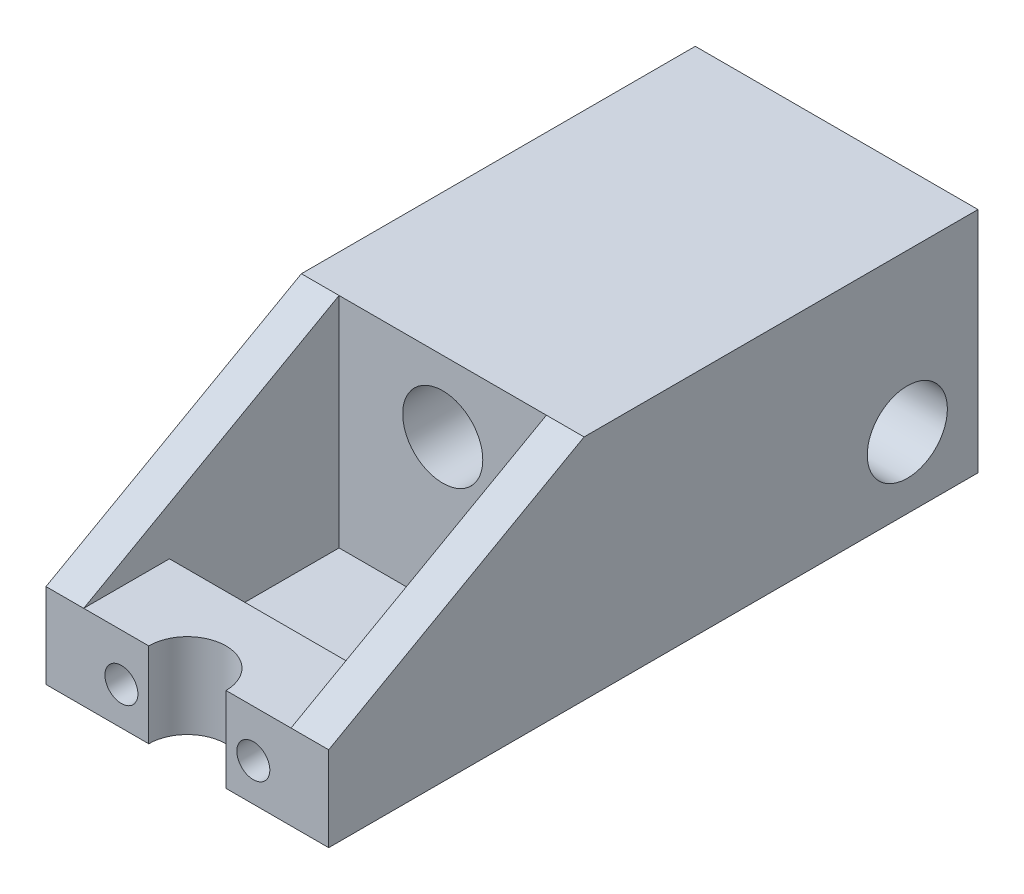
ISO-10303-21;
HEADER;
FILE_DESCRIPTION(('STEP AP214'),'2;1');
FILE_NAME('part.step','',(''),(''),'','','');
FILE_SCHEMA(('AUTOMOTIVE_DESIGN { 1 0 10303 214 1 1 1 1 }'));
ENDSEC;
DATA;
#1=APPLICATION_CONTEXT('core data for automotive mechanical design processes');
#2=APPLICATION_PROTOCOL_DEFINITION('international standard','automotive_design',2000,#1);
#3=PRODUCT_CONTEXT('',#1,'mechanical');
#4=PRODUCT('Part','Part','',(#3));
#5=PRODUCT_RELATED_PRODUCT_CATEGORY('part','',(#4));
#6=PRODUCT_DEFINITION_FORMATION('','',#4);
#7=PRODUCT_DEFINITION_CONTEXT('part definition',#1,'design');
#8=PRODUCT_DEFINITION('design','',#6,#7);
#9=PRODUCT_DEFINITION_SHAPE('','',#8);
#10=(LENGTH_UNIT() NAMED_UNIT(*) SI_UNIT(.MILLI.,.METRE.));
#11=(NAMED_UNIT(*) PLANE_ANGLE_UNIT() SI_UNIT($,.RADIAN.));
#12=(NAMED_UNIT(*) SI_UNIT($,.STERADIAN.) SOLID_ANGLE_UNIT());
#13=UNCERTAINTY_MEASURE_WITH_UNIT(LENGTH_MEASURE(1.E-05),#10,'distance_accuracy_value','');
#14=(GEOMETRIC_REPRESENTATION_CONTEXT(3) GLOBAL_UNCERTAINTY_ASSIGNED_CONTEXT((#13)) GLOBAL_UNIT_ASSIGNED_CONTEXT((#10,
#11,#12)) REPRESENTATION_CONTEXT('',''));
#15=CARTESIAN_POINT('',(0.,0.,0.));
#16=DIRECTION('',(0.,0.,1.));
#17=DIRECTION('',(1.,0.,0.));
#18=AXIS2_PLACEMENT_3D('',#15,#16,#17);
#19=CARTESIAN_POINT('',(-15.,-3.1,61.4));
#20=DIRECTION('',(0.,-1.,0.));
#21=DIRECTION('',(0.,0.,-1.));
#22=AXIS2_PLACEMENT_3D('',#19,#20,#21);
#23=PLANE('',#22);
#24=DIRECTION('',(-1.,0.,0.));
#25=VECTOR('',#24,1.);
#26=CARTESIAN_POINT('',(-15.,-3.1,61.4));
#27=LINE('',#26,#25);
#28=CARTESIAN_POINT('',(11.,-3.1,61.4));
#29=VERTEX_POINT('',#28);
#30=CARTESIAN_POINT('',(4.1,-3.1,61.4));
#31=VERTEX_POINT('',#30);
#32=EDGE_CURVE('E376',#29,#31,#27,.T.);
#33=ORIENTED_EDGE('',*,*,#32,.F.);
#34=DIRECTION('',(0.,0.,-1.));
#35=VECTOR('',#34,1.);
#36=CARTESIAN_POINT('',(11.,-3.1,61.4));
#37=LINE('',#36,#35);
#38=CARTESIAN_POINT('',(11.,-3.1,52.3));
#39=VERTEX_POINT('',#38);
#40=EDGE_CURVE('E223',#29,#39,#37,.T.);
#41=ORIENTED_EDGE('',*,*,#40,.T.);
#42=DIRECTION('',(1.,0.,0.));
#43=VECTOR('',#42,1.);
#44=CARTESIAN_POINT('',(11.,-3.1,52.3));
#45=LINE('',#44,#43);
#46=CARTESIAN_POINT('',(-11.,-3.1,52.3));
#47=VERTEX_POINT('',#46);
#48=EDGE_CURVE('E335',#47,#39,#45,.T.);
#49=ORIENTED_EDGE('',*,*,#48,.F.);
#50=DIRECTION('',(0.,0.,1.));
#51=VECTOR('',#50,1.);
#52=CARTESIAN_POINT('',(-11.,-3.1,61.4));
#53=LINE('',#52,#51);
#54=CARTESIAN_POINT('',(-11.,-3.1,61.4));
#55=VERTEX_POINT('',#54);
#56=EDGE_CURVE('E50',#47,#55,#53,.T.);
#57=ORIENTED_EDGE('',*,*,#56,.T.);
#58=CARTESIAN_POINT('',(-4.1,-3.1,61.4));
#59=VERTEX_POINT('',#58);
#60=EDGE_CURVE('E371',#59,#55,#27,.T.);
#61=ORIENTED_EDGE('',*,*,#60,.F.);
#62=CARTESIAN_POINT('',(0.,-3.1,61.4));
#63=DIRECTION('',(0.,1.,0.));
#64=DIRECTION('',(0.,0.,1.));
#65=AXIS2_PLACEMENT_3D('',#62,#63,#64);
#66=CIRCLE('',#65,4.1);
#67=EDGE_CURVE('E353',#31,#59,#66,.T.);
#68=ORIENTED_EDGE('',*,*,#67,.F.);
#69=EDGE_LOOP('',(#33,#41,#49,#57,#61,#68));
#70=FACE_BOUND('',#69,.T.);
#71=ADVANCED_FACE('F33',(#70),#23,.F.);
#72=CARTESIAN_POINT('',(11.,-11.1,34.3));
#73=DIRECTION('',(0.,0.,-1.));
#74=DIRECTION('',(-1.,0.,0.));
#75=AXIS2_PLACEMENT_3D('',#72,#73,#74);
#76=PLANE('',#75);
#77=CARTESIAN_POINT('',(0.,4.6,34.3));
#78=DIRECTION('',(0.,0.,1.));
#79=DIRECTION('',(1.,0.,0.));
#80=AXIS2_PLACEMENT_3D('',#77,#78,#79);
#81=CIRCLE('',#80,4.25);
#82=CARTESIAN_POINT('',(4.25,4.6,34.3));
#83=VERTEX_POINT('',#82);
#84=EDGE_CURVE('E231',#83,#83,#81,.F.);
#85=ORIENTED_EDGE('',*,*,#84,.T.);
#86=EDGE_LOOP('',(#85));
#87=FACE_BOUND('',#86,.T.);
#88=DIRECTION('',(0.,1.,0.));
#89=VECTOR('',#88,1.);
#90=CARTESIAN_POINT('',(11.,-11.1,34.3));
#91=LINE('',#90,#89);
#92=CARTESIAN_POINT('',(11.,-11.1,34.3));
#93=VERTEX_POINT('',#92);
#94=CARTESIAN_POINT('',(11.,12.1,34.3));
#95=VERTEX_POINT('',#94);
#96=EDGE_CURVE('E196',#93,#95,#91,.T.);
#97=ORIENTED_EDGE('',*,*,#96,.T.);
#98=DIRECTION('',(-1.,0.,0.));
#99=VECTOR('',#98,1.);
#100=CARTESIAN_POINT('',(0.,12.1,34.3));
#101=LINE('',#100,#99);
#102=CARTESIAN_POINT('',(-11.,12.1,34.3));
#103=VERTEX_POINT('',#102);
#104=EDGE_CURVE('E58',#95,#103,#101,.T.);
#105=ORIENTED_EDGE('',*,*,#104,.T.);
#106=DIRECTION('',(0.,1.,0.));
#107=VECTOR('',#106,1.);
#108=CARTESIAN_POINT('',(-11.,-11.1,34.3));
#109=LINE('',#108,#107);
#110=CARTESIAN_POINT('',(-11.,-11.1,34.3));
#111=VERTEX_POINT('',#110);
#112=EDGE_CURVE('E205',#111,#103,#109,.T.);
#113=ORIENTED_EDGE('',*,*,#112,.F.);
#114=DIRECTION('',(-1.,0.,0.));
#115=VECTOR('',#114,1.);
#116=CARTESIAN_POINT('',(11.,-11.1,34.3));
#117=LINE('',#116,#115);
#118=EDGE_CURVE('E200',#93,#111,#117,.T.);
#119=ORIENTED_EDGE('',*,*,#118,.F.);
#120=EDGE_LOOP('',(#97,#105,#113,#119));
#121=FACE_BOUND('',#120,.T.);
#122=ADVANCED_FACE('F198',(#87,#121),#76,.F.);
#123=CARTESIAN_POINT('',(11.,-11.1,52.3));
#124=DIRECTION('',(0.,0.,1.));
#125=DIRECTION('',(1.,0.,0.));
#126=AXIS2_PLACEMENT_3D('',#123,#124,#125);
#127=PLANE('',#126);
#128=ORIENTED_EDGE('',*,*,#48,.T.);
#129=DIRECTION('',(0.,1.,0.));
#130=VECTOR('',#129,1.);
#131=CARTESIAN_POINT('',(11.,-11.1,52.3));
#132=LINE('',#131,#130);
#133=CARTESIAN_POINT('',(11.,-11.1,52.3));
#134=VERTEX_POINT('',#133);
#135=EDGE_CURVE('E206',#134,#39,#132,.T.);
#136=ORIENTED_EDGE('',*,*,#135,.F.);
#137=DIRECTION('',(1.,0.,0.));
#138=VECTOR('',#137,1.);
#139=CARTESIAN_POINT('',(11.,-11.1,52.3));
#140=LINE('',#139,#138);
#141=CARTESIAN_POINT('',(-11.,-11.1,52.3));
#142=VERTEX_POINT('',#141);
#143=EDGE_CURVE('E336',#142,#134,#140,.T.);
#144=ORIENTED_EDGE('',*,*,#143,.F.);
#145=DIRECTION('',(0.,1.,0.));
#146=VECTOR('',#145,1.);
#147=CARTESIAN_POINT('',(-11.,-11.1,52.3));
#148=LINE('',#147,#146);
#149=EDGE_CURVE('E347',#142,#47,#148,.T.);
#150=ORIENTED_EDGE('',*,*,#149,.T.);
#151=EDGE_LOOP('',(#128,#136,#144,#150));
#152=FACE_BOUND('',#151,.T.);
#153=DIRECTION('',(0.5,0.866025403784439,0.));
#154=VECTOR('',#153,1.);
#155=CARTESIAN_POINT('',(3.75,-8.1,52.3));
#156=LINE('',#155,#154);
#157=CARTESIAN_POINT('',(3.75,-8.1,52.3));
#158=VERTEX_POINT('',#157);
#159=CARTESIAN_POINT('',(5.375,-5.28541743770058,52.3));
#160=VERTEX_POINT('',#159);
#161=EDGE_CURVE('E302',#158,#160,#156,.T.);
#162=ORIENTED_EDGE('',*,*,#161,.F.);
#163=DIRECTION('',(-0.5,0.866025403784439,0.));
#164=VECTOR('',#163,1.);
#165=CARTESIAN_POINT('',(5.375,-10.9145825622994,52.3));
#166=LINE('',#165,#164);
#167=CARTESIAN_POINT('',(5.375,-10.9145825622994,52.3));
#168=VERTEX_POINT('',#167);
#169=EDGE_CURVE('E300',#168,#158,#166,.T.);
#170=ORIENTED_EDGE('',*,*,#169,.F.);
#171=DIRECTION('',(-1.,0.,0.));
#172=VECTOR('',#171,1.);
#173=CARTESIAN_POINT('',(8.625,-10.9145825622994,52.3));
#174=LINE('',#173,#172);
#175=CARTESIAN_POINT('',(8.625,-10.9145825622994,52.3));
#176=VERTEX_POINT('',#175);
#177=EDGE_CURVE('E284',#176,#168,#174,.T.);
#178=ORIENTED_EDGE('',*,*,#177,.F.);
#179=DIRECTION('',(-0.5,-0.866025403784439,0.));
#180=VECTOR('',#179,1.);
#181=CARTESIAN_POINT('',(10.25,-8.1,52.3));
#182=LINE('',#181,#180);
#183=CARTESIAN_POINT('',(10.25,-8.1,52.3));
#184=VERTEX_POINT('',#183);
#185=EDGE_CURVE('E311',#184,#176,#182,.T.);
#186=ORIENTED_EDGE('',*,*,#185,.F.);
#187=DIRECTION('',(0.5,-0.866025403784438,0.));
#188=VECTOR('',#187,1.);
#189=CARTESIAN_POINT('',(8.625,-5.28541743770058,52.3));
#190=LINE('',#189,#188);
#191=CARTESIAN_POINT('',(8.625,-5.28541743770058,52.3));
#192=VERTEX_POINT('',#191);
#193=EDGE_CURVE('E308',#192,#184,#190,.T.);
#194=ORIENTED_EDGE('',*,*,#193,.F.);
#195=DIRECTION('',(1.,0.,0.));
#196=VECTOR('',#195,1.);
#197=CARTESIAN_POINT('',(5.375,-5.28541743770058,52.3));
#198=LINE('',#197,#196);
#199=EDGE_CURVE('E305',#160,#192,#198,.T.);
#200=ORIENTED_EDGE('',*,*,#199,.F.);
#201=EDGE_LOOP('',(#162,#170,#178,#186,#194,#200));
#202=FACE_BOUND('',#201,.T.);
#203=DIRECTION('',(0.5,0.866025403784439,0.));
#204=VECTOR('',#203,1.);
#205=CARTESIAN_POINT('',(-5.375,-10.9145825622994,52.3));
#206=LINE('',#205,#204);
#207=CARTESIAN_POINT('',(-5.375,-10.9145825622994,52.3));
#208=VERTEX_POINT('',#207);
#209=CARTESIAN_POINT('',(-3.75,-8.1,52.3));
#210=VERTEX_POINT('',#209);
#211=EDGE_CURVE('E266',#208,#210,#206,.T.);
#212=ORIENTED_EDGE('',*,*,#211,.T.);
#213=DIRECTION('',(-0.5,0.866025403784439,0.));
#214=VECTOR('',#213,1.);
#215=CARTESIAN_POINT('',(-3.75,-8.1,52.3));
#216=LINE('',#215,#214);
#217=CARTESIAN_POINT('',(-5.375,-5.28541743770058,52.3));
#218=VERTEX_POINT('',#217);
#219=EDGE_CURVE('E263',#210,#218,#216,.T.);
#220=ORIENTED_EDGE('',*,*,#219,.T.);
#221=DIRECTION('',(-1.,0.,0.));
#222=VECTOR('',#221,1.);
#223=CARTESIAN_POINT('',(-5.375,-5.28541743770058,52.3));
#224=LINE('',#223,#222);
#225=CARTESIAN_POINT('',(-8.625,-5.28541743770058,52.3));
#226=VERTEX_POINT('',#225);
#227=EDGE_CURVE('E260',#218,#226,#224,.T.);
#228=ORIENTED_EDGE('',*,*,#227,.T.);
#229=DIRECTION('',(-0.5,-0.866025403784438,0.));
#230=VECTOR('',#229,1.);
#231=CARTESIAN_POINT('',(-8.625,-5.28541743770058,52.3));
#232=LINE('',#231,#230);
#233=CARTESIAN_POINT('',(-10.25,-8.1,52.3));
#234=VERTEX_POINT('',#233);
#235=EDGE_CURVE('E257',#226,#234,#232,.T.);
#236=ORIENTED_EDGE('',*,*,#235,.T.);
#237=DIRECTION('',(0.5,-0.866025403784439,0.));
#238=VECTOR('',#237,1.);
#239=CARTESIAN_POINT('',(-10.25,-8.1,52.3));
#240=LINE('',#239,#238);
#241=CARTESIAN_POINT('',(-8.625,-10.9145825622994,52.3));
#242=VERTEX_POINT('',#241);
#243=EDGE_CURVE('E253',#234,#242,#240,.T.);
#244=ORIENTED_EDGE('',*,*,#243,.T.);
#245=DIRECTION('',(1.,0.,0.));
#246=VECTOR('',#245,1.);
#247=CARTESIAN_POINT('',(-8.625,-10.9145825622994,52.3));
#248=LINE('',#247,#246);
#249=EDGE_CURVE('E250',#242,#208,#248,.T.);
#250=ORIENTED_EDGE('',*,*,#249,.T.);
#251=EDGE_LOOP('',(#212,#220,#228,#236,#244,#250));
#252=FACE_BOUND('',#251,.T.);
#253=ADVANCED_FACE('F408',(#152,#202,#252),#127,.F.);
#254=CARTESIAN_POINT('',(7.,-8.1,-7.501));
#255=DIRECTION('',(0.,0.,1.));
#256=DIRECTION('',(1.,0.,0.));
#257=AXIS2_PLACEMENT_3D('',#254,#255,#256);
#258=CYLINDRICAL_SURFACE('',#257,1.75);
#259=CARTESIAN_POINT('',(7.,-8.1,61.4));
#260=DIRECTION('',(0.,0.,1.));
#261=DIRECTION('',(-1.,0.,0.));
#262=AXIS2_PLACEMENT_3D('',#259,#260,#261);
#263=CIRCLE('',#262,1.75);
#264=CARTESIAN_POINT('',(5.25,-8.1,61.4));
#265=VERTEX_POINT('',#264);
#266=EDGE_CURVE('E329',#265,#265,#263,.T.);
#267=ORIENTED_EDGE('',*,*,#266,.T.);
#268=EDGE_LOOP('',(#267));
#269=FACE_BOUND('',#268,.T.);
#270=CARTESIAN_POINT('',(7.,-8.1,55.4));
#271=DIRECTION('',(0.,0.,-1.));
#272=DIRECTION('',(-1.,0.,0.));
#273=AXIS2_PLACEMENT_3D('',#270,#271,#272);
#274=CIRCLE('',#273,1.75);
#275=CARTESIAN_POINT('',(5.25,-8.1,55.4));
#276=VERTEX_POINT('',#275);
#277=EDGE_CURVE('E318',#276,#276,#274,.F.);
#278=ORIENTED_EDGE('',*,*,#277,.F.);
#279=EDGE_LOOP('',(#278));
#280=FACE_BOUND('',#279,.T.);
#281=ADVANCED_FACE('F405',(#269,#280),#258,.F.);
#282=CARTESIAN_POINT('',(0.,0.,61.4));
#283=DIRECTION('',(0.,0.,-1.));
#284=DIRECTION('',(-1.,0.,0.));
#285=AXIS2_PLACEMENT_3D('',#282,#283,#284);
#286=PLANE('',#285);
#287=CARTESIAN_POINT('',(-7.,-8.1,61.4));
#288=DIRECTION('',(0.,0.,1.));
#289=DIRECTION('',(1.,0.,0.));
#290=AXIS2_PLACEMENT_3D('',#287,#288,#289);
#291=CIRCLE('',#290,1.75);
#292=CARTESIAN_POINT('',(-5.25,-8.1,61.4));
#293=VERTEX_POINT('',#292);
#294=EDGE_CURVE('E332',#293,#293,#291,.T.);
#295=ORIENTED_EDGE('',*,*,#294,.F.);
#296=EDGE_LOOP('',(#295));
#297=FACE_BOUND('',#296,.T.);
#298=DIRECTION('',(1.,0.,0.));
#299=VECTOR('',#298,1.);
#300=CARTESIAN_POINT('',(-15.,-12.1,61.4));
#301=LINE('',#300,#299);
#302=CARTESIAN_POINT('',(-15.,-12.1,61.4));
#303=VERTEX_POINT('',#302);
#304=CARTESIAN_POINT('',(-4.1,-12.1,61.4));
#305=VERTEX_POINT('',#304);
#306=EDGE_CURVE('E365',#303,#305,#301,.T.);
#307=ORIENTED_EDGE('',*,*,#306,.T.);
#308=DIRECTION('',(0.,1.,0.));
#309=VECTOR('',#308,1.);
#310=CARTESIAN_POINT('',(-4.1,-12.101,61.4));
#311=LINE('',#310,#309);
#312=EDGE_CURVE('E355',#305,#59,#311,.T.);
#313=ORIENTED_EDGE('',*,*,#312,.T.);
#314=ORIENTED_EDGE('',*,*,#60,.T.);
#315=DIRECTION('',(-1.,0.,0.));
#316=VECTOR('',#315,1.);
#317=CARTESIAN_POINT('',(-11.,-3.1,61.4));
#318=LINE('',#317,#316);
#319=CARTESIAN_POINT('',(-15.,-3.1,61.4));
#320=VERTEX_POINT('',#319);
#321=EDGE_CURVE('E467',#55,#320,#318,.T.);
#322=ORIENTED_EDGE('',*,*,#321,.T.);
#323=DIRECTION('',(0.,-1.,0.));
#324=VECTOR('',#323,1.);
#325=CARTESIAN_POINT('',(-15.,-12.1,61.4));
#326=LINE('',#325,#324);
#327=EDGE_CURVE('E359',#320,#303,#326,.T.);
#328=ORIENTED_EDGE('',*,*,#327,.T.);
#329=EDGE_LOOP('',(#307,#313,#314,#322,#328));
#330=FACE_BOUND('',#329,.T.);
#331=ADVANCED_FACE('F407',(#297,#330),#286,.F.);
#332=CARTESIAN_POINT('',(0.,0.,-7.5));
#333=DIRECTION('',(0.,0.,1.));
#334=DIRECTION('',(1.,0.,0.));
#335=AXIS2_PLACEMENT_3D('',#332,#333,#334);
#336=PLANE('',#335);
#337=DIRECTION('',(0.,-1.,0.));
#338=VECTOR('',#337,1.);
#339=CARTESIAN_POINT('',(-15.,-12.1,-7.5));
#340=LINE('',#339,#338);
#341=CARTESIAN_POINT('',(-15.,12.1,-7.5));
#342=VERTEX_POINT('',#341);
#343=CARTESIAN_POINT('',(-15.,-12.1,-7.5));
#344=VERTEX_POINT('',#343);
#345=EDGE_CURVE('E385',#342,#344,#340,.T.);
#346=ORIENTED_EDGE('',*,*,#345,.F.);
#347=DIRECTION('',(-1.,0.,0.));
#348=VECTOR('',#347,1.);
#349=CARTESIAN_POINT('',(15.,12.1,-7.5));
#350=LINE('',#349,#348);
#351=CARTESIAN_POINT('',(15.,12.1,-7.5));
#352=VERTEX_POINT('',#351);
#353=EDGE_CURVE('E392',#352,#342,#350,.T.);
#354=ORIENTED_EDGE('',*,*,#353,.F.);
#355=DIRECTION('',(0.,1.,0.));
#356=VECTOR('',#355,1.);
#357=CARTESIAN_POINT('',(15.,-12.1,-7.5));
#358=LINE('',#357,#356);
#359=CARTESIAN_POINT('',(15.,-12.1,-7.5));
#360=VERTEX_POINT('',#359);
#361=EDGE_CURVE('E390',#360,#352,#358,.T.);
#362=ORIENTED_EDGE('',*,*,#361,.F.);
#363=DIRECTION('',(1.,0.,0.));
#364=VECTOR('',#363,1.);
#365=CARTESIAN_POINT('',(15.,-12.1,-7.5));
#366=LINE('',#365,#364);
#367=EDGE_CURVE('E388',#344,#360,#366,.T.);
#368=ORIENTED_EDGE('',*,*,#367,.F.);
#369=EDGE_LOOP('',(#346,#354,#362,#368));
#370=FACE_BOUND('',#369,.T.);
#371=CARTESIAN_POINT('',(0.,4.6,-7.5));
#372=DIRECTION('',(0.,0.,1.));
#373=DIRECTION('',(1.,0.,0.));
#374=AXIS2_PLACEMENT_3D('',#371,#372,#373);
#375=CIRCLE('',#374,4.25);
#376=CARTESIAN_POINT('',(4.25,4.6,-7.5));
#377=VERTEX_POINT('',#376);
#378=EDGE_CURVE('E382',#377,#377,#375,.T.);
#379=ORIENTED_EDGE('',*,*,#378,.T.);
#380=EDGE_LOOP('',(#379));
#381=FACE_BOUND('',#380,.T.);
#382=ADVANCED_FACE('F415',(#370,#381),#336,.F.);
#383=CARTESIAN_POINT('',(-15.,-12.1,7.5));
#384=DIRECTION('',(1.,0.,0.));
#385=DIRECTION('',(0.,0.,-1.));
#386=AXIS2_PLACEMENT_3D('',#383,#384,#385);
#387=PLANE('',#386);
#388=CARTESIAN_POINT('',(-15.,-4.6,0.));
#389=DIRECTION('',(1.,0.,0.));
#390=DIRECTION('',(0.,0.,-1.));
#391=AXIS2_PLACEMENT_3D('',#388,#389,#390);
#392=CIRCLE('',#391,4.25);
#393=CARTESIAN_POINT('',(-15.,-4.6,-4.25));
#394=VERTEX_POINT('',#393);
#395=EDGE_CURVE('E379',#394,#394,#392,.F.);
#396=ORIENTED_EDGE('',*,*,#395,.F.);
#397=EDGE_LOOP('',(#396));
#398=FACE_BOUND('',#397,.T.);
#399=ORIENTED_EDGE('',*,*,#345,.T.);
#400=DIRECTION('',(0.,0.,-1.));
#401=VECTOR('',#400,1.);
#402=CARTESIAN_POINT('',(-15.,-12.1,7.5));
#403=LINE('',#402,#401);
#404=EDGE_CURVE('E11',#303,#344,#403,.T.);
#405=ORIENTED_EDGE('',*,*,#404,.F.);
#406=ORIENTED_EDGE('',*,*,#327,.F.);
#407=DIRECTION('',(0.,0.489191265938875,-0.872176533351546));
#408=VECTOR('',#407,1.);
#409=CARTESIAN_POINT('',(-15.,12.1,34.3));
#410=LINE('',#409,#408);
#411=CARTESIAN_POINT('',(-15.,12.1,34.3));
#412=VERTEX_POINT('',#411);
#413=EDGE_CURVE('E475',#320,#412,#410,.T.);
#414=ORIENTED_EDGE('',*,*,#413,.T.);
#415=DIRECTION('',(0.,0.,-1.));
#416=VECTOR('',#415,1.);
#417=CARTESIAN_POINT('',(-15.,12.1,7.5));
#418=LINE('',#417,#416);
#419=EDGE_CURVE('E394',#412,#342,#418,.T.);
#420=ORIENTED_EDGE('',*,*,#419,.T.);
#421=EDGE_LOOP('',(#399,#405,#406,#414,#420));
#422=FACE_BOUND('',#421,.T.);
#423=ADVANCED_FACE('F35',(#398,#422),#387,.F.);
#424=CARTESIAN_POINT('',(15.,-12.1,7.5));
#425=DIRECTION('',(0.,1.,0.));
#426=DIRECTION('',(0.,0.,1.));
#427=AXIS2_PLACEMENT_3D('',#424,#425,#426);
#428=PLANE('',#427);
#429=CARTESIAN_POINT('',(4.1,-12.1,61.4));
#430=VERTEX_POINT('',#429);
#431=CARTESIAN_POINT('',(15.,-12.1,61.4));
#432=VERTEX_POINT('',#431);
#433=EDGE_CURVE('E364',#430,#432,#301,.T.);
#434=ORIENTED_EDGE('',*,*,#433,.F.);
#435=CARTESIAN_POINT('',(0.,-12.1,61.4));
#436=DIRECTION('',(0.,1.,0.));
#437=DIRECTION('',(0.,0.,1.));
#438=AXIS2_PLACEMENT_3D('',#435,#436,#437);
#439=CIRCLE('',#438,4.1);
#440=EDGE_CURVE('E349',#305,#430,#439,.F.);
#441=ORIENTED_EDGE('',*,*,#440,.F.);
#442=ORIENTED_EDGE('',*,*,#306,.F.);
#443=ORIENTED_EDGE('',*,*,#404,.T.);
#444=ORIENTED_EDGE('',*,*,#367,.T.);
#445=DIRECTION('',(0.,0.,-1.));
#446=VECTOR('',#445,1.);
#447=CARTESIAN_POINT('',(15.,-12.1,7.5));
#448=LINE('',#447,#446);
#449=EDGE_CURVE('E42',#432,#360,#448,.T.);
#450=ORIENTED_EDGE('',*,*,#449,.F.);
#451=EDGE_LOOP('',(#434,#441,#442,#443,#444,#450));
#452=FACE_BOUND('',#451,.T.);
#453=ADVANCED_FACE('F447',(#452),#428,.F.);
#454=CARTESIAN_POINT('',(15.,-12.1,7.5));
#455=DIRECTION('',(-1.,0.,0.));
#456=DIRECTION('',(0.,0.,1.));
#457=AXIS2_PLACEMENT_3D('',#454,#455,#456);
#458=PLANE('',#457);
#459=DIRECTION('',(0.,0.,-1.));
#460=VECTOR('',#459,1.);
#461=CARTESIAN_POINT('',(15.,12.1,7.5));
#462=LINE('',#461,#460);
#463=CARTESIAN_POINT('',(15.,12.1,34.3));
#464=VERTEX_POINT('',#463);
#465=EDGE_CURVE('E397',#464,#352,#462,.T.);
#466=ORIENTED_EDGE('',*,*,#465,.F.);
#467=DIRECTION('',(0.,-0.489191265938875,0.872176533351546));
#468=VECTOR('',#467,1.);
#469=CARTESIAN_POINT('',(15.,12.1,34.3));
#470=LINE('',#469,#468);
#471=CARTESIAN_POINT('',(15.,-3.1,61.4));
#472=VERTEX_POINT('',#471);
#473=EDGE_CURVE('E215',#464,#472,#470,.T.);
#474=ORIENTED_EDGE('',*,*,#473,.T.);
#475=DIRECTION('',(0.,1.,0.));
#476=VECTOR('',#475,1.);
#477=CARTESIAN_POINT('',(15.,-12.1,61.4));
#478=LINE('',#477,#476);
#479=EDGE_CURVE('E368',#432,#472,#478,.T.);
#480=ORIENTED_EDGE('',*,*,#479,.F.);
#481=ORIENTED_EDGE('',*,*,#449,.T.);
#482=ORIENTED_EDGE('',*,*,#361,.T.);
#483=EDGE_LOOP('',(#466,#474,#480,#481,#482));
#484=FACE_BOUND('',#483,.T.);
#485=CARTESIAN_POINT('',(15.,-4.6,0.));
#486=DIRECTION('',(1.,0.,0.));
#487=DIRECTION('',(0.,0.,-1.));
#488=AXIS2_PLACEMENT_3D('',#485,#486,#487);
#489=CIRCLE('',#488,4.25);
#490=CARTESIAN_POINT('',(15.,-4.6,-4.25));
#491=VERTEX_POINT('',#490);
#492=EDGE_CURVE('E375',#491,#491,#489,.T.);
#493=ORIENTED_EDGE('',*,*,#492,.F.);
#494=EDGE_LOOP('',(#493));
#495=FACE_BOUND('',#494,.T.);
#496=ADVANCED_FACE('F445',(#484,#495),#458,.F.);
#497=CARTESIAN_POINT('',(15.,12.1,7.5));
#498=DIRECTION('',(0.,-1.,0.));
#499=DIRECTION('',(0.,0.,-1.));
#500=AXIS2_PLACEMENT_3D('',#497,#498,#499);
#501=PLANE('',#500);
#502=ORIENTED_EDGE('',*,*,#353,.T.);
#503=ORIENTED_EDGE('',*,*,#419,.F.);
#504=DIRECTION('',(-1.,0.,0.));
#505=VECTOR('',#504,1.);
#506=CARTESIAN_POINT('',(-11.,12.1,34.3));
#507=LINE('',#506,#505);
#508=EDGE_CURVE('E229',#103,#412,#507,.T.);
#509=ORIENTED_EDGE('',*,*,#508,.F.);
#510=ORIENTED_EDGE('',*,*,#104,.F.);
#511=EDGE_CURVE('E210',#464,#95,#101,.T.);
#512=ORIENTED_EDGE('',*,*,#511,.F.);
#513=ORIENTED_EDGE('',*,*,#465,.T.);
#514=EDGE_LOOP('',(#502,#503,#509,#510,#512,#513));
#515=FACE_BOUND('',#514,.T.);
#516=ADVANCED_FACE('F227',(#515),#501,.F.);
#517=CARTESIAN_POINT('',(0.,4.6,7.5));
#518=DIRECTION('',(0.,0.,-1.));
#519=DIRECTION('',(-1.,0.,0.));
#520=AXIS2_PLACEMENT_3D('',#517,#518,#519);
#521=CYLINDRICAL_SURFACE('',#520,4.25);
#522=ORIENTED_EDGE('',*,*,#378,.F.);
#523=EDGE_LOOP('',(#522));
#524=FACE_BOUND('',#523,.T.);
#525=ORIENTED_EDGE('',*,*,#84,.F.);
#526=EDGE_LOOP('',(#525));
#527=FACE_BOUND('',#526,.T.);
#528=ADVANCED_FACE('F435',(#524,#527),#521,.F.);
#529=CARTESIAN_POINT('',(-15.001,-4.6,0.));
#530=DIRECTION('',(1.,0.,0.));
#531=DIRECTION('',(0.,0.,-1.));
#532=AXIS2_PLACEMENT_3D('',#529,#530,#531);
#533=CYLINDRICAL_SURFACE('',#532,4.25);
#534=ORIENTED_EDGE('',*,*,#492,.T.);
#535=EDGE_LOOP('',(#534));
#536=FACE_BOUND('',#535,.T.);
#537=ORIENTED_EDGE('',*,*,#395,.T.);
#538=EDGE_LOOP('',(#537));
#539=FACE_BOUND('',#538,.T.);
#540=ADVANCED_FACE('F432',(#536,#539),#533,.F.);
#541=ORIENTED_EDGE('',*,*,#266,.F.);
#542=EDGE_LOOP('',(#541));
#543=FACE_BOUND('',#542,.T.);
#544=EDGE_CURVE('E372',#472,#29,#27,.T.);
#545=ORIENTED_EDGE('',*,*,#544,.T.);
#546=ORIENTED_EDGE('',*,*,#32,.T.);
#547=DIRECTION('',(0.,1.,0.));
#548=VECTOR('',#547,1.);
#549=CARTESIAN_POINT('',(4.1,-12.101,61.4));
#550=LINE('',#549,#548);
#551=EDGE_CURVE('E356',#430,#31,#550,.T.);
#552=ORIENTED_EDGE('',*,*,#551,.F.);
#553=ORIENTED_EDGE('',*,*,#433,.T.);
#554=ORIENTED_EDGE('',*,*,#479,.T.);
#555=EDGE_LOOP('',(#545,#546,#552,#553,#554));
#556=FACE_BOUND('',#555,.T.);
#557=ADVANCED_FACE('F418',(#543,#556),#286,.F.);
#558=CARTESIAN_POINT('',(0.,-12.101,61.4));
#559=DIRECTION('',(0.,1.,0.));
#560=DIRECTION('',(0.,0.,1.));
#561=AXIS2_PLACEMENT_3D('',#558,#559,#560);
#562=CYLINDRICAL_SURFACE('',#561,4.1);
#563=ORIENTED_EDGE('',*,*,#440,.T.);
#564=ORIENTED_EDGE('',*,*,#551,.T.);
#565=ORIENTED_EDGE('',*,*,#67,.T.);
#566=ORIENTED_EDGE('',*,*,#312,.F.);
#567=EDGE_LOOP('',(#563,#564,#565,#566));
#568=FACE_BOUND('',#567,.T.);
#569=ADVANCED_FACE('F464',(#568),#562,.F.);
#570=CARTESIAN_POINT('',(-11.,-11.1,52.3));
#571=DIRECTION('',(-1.,0.,0.));
#572=DIRECTION('',(0.,0.,1.));
#573=AXIS2_PLACEMENT_3D('',#570,#571,#572);
#574=PLANE('',#573);
#575=ORIENTED_EDGE('',*,*,#112,.T.);
#576=DIRECTION('',(0.,0.489191265938875,-0.872176533351546));
#577=VECTOR('',#576,1.);
#578=CARTESIAN_POINT('',(-11.,12.1,34.3));
#579=LINE('',#578,#577);
#580=EDGE_CURVE('E473',#55,#103,#579,.T.);
#581=ORIENTED_EDGE('',*,*,#580,.F.);
#582=ORIENTED_EDGE('',*,*,#56,.F.);
#583=ORIENTED_EDGE('',*,*,#149,.F.);
#584=DIRECTION('',(0.,0.,1.));
#585=VECTOR('',#584,1.);
#586=CARTESIAN_POINT('',(-11.,-11.1,52.3));
#587=LINE('',#586,#585);
#588=EDGE_CURVE('E342',#111,#142,#587,.T.);
#589=ORIENTED_EDGE('',*,*,#588,.F.);
#590=EDGE_LOOP('',(#575,#581,#582,#583,#589));
#591=FACE_BOUND('',#590,.T.);
#592=ADVANCED_FACE('F477',(#591),#574,.F.);
#593=CARTESIAN_POINT('',(11.,-11.1,52.3));
#594=DIRECTION('',(1.,0.,0.));
#595=DIRECTION('',(0.,0.,-1.));
#596=AXIS2_PLACEMENT_3D('',#593,#594,#595);
#597=PLANE('',#596);
#598=ORIENTED_EDGE('',*,*,#135,.T.);
#599=ORIENTED_EDGE('',*,*,#40,.F.);
#600=DIRECTION('',(0.,-0.489191265938875,0.872176533351546));
#601=VECTOR('',#600,1.);
#602=CARTESIAN_POINT('',(11.,12.1,34.3));
#603=LINE('',#602,#601);
#604=EDGE_CURVE('E212',#95,#29,#603,.T.);
#605=ORIENTED_EDGE('',*,*,#604,.F.);
#606=ORIENTED_EDGE('',*,*,#96,.F.);
#607=DIRECTION('',(0.,0.,-1.));
#608=VECTOR('',#607,1.);
#609=CARTESIAN_POINT('',(11.,-11.1,52.3));
#610=LINE('',#609,#608);
#611=EDGE_CURVE('E339',#134,#93,#610,.T.);
#612=ORIENTED_EDGE('',*,*,#611,.F.);
#613=EDGE_LOOP('',(#598,#599,#605,#606,#612));
#614=FACE_BOUND('',#613,.T.);
#615=ADVANCED_FACE('F222',(#614),#597,.F.);
#616=CARTESIAN_POINT('',(0.,-11.1,0.));
#617=DIRECTION('',(0.,-1.,0.));
#618=DIRECTION('',(0.,0.,-1.));
#619=AXIS2_PLACEMENT_3D('',#616,#617,#618);
#620=PLANE('',#619);
#621=ORIENTED_EDGE('',*,*,#143,.T.);
#622=ORIENTED_EDGE('',*,*,#611,.T.);
#623=ORIENTED_EDGE('',*,*,#118,.T.);
#624=ORIENTED_EDGE('',*,*,#588,.T.);
#625=EDGE_LOOP('',(#621,#622,#623,#624));
#626=FACE_BOUND('',#625,.T.);
#627=ADVANCED_FACE('F494',(#626),#620,.F.);
#628=CARTESIAN_POINT('',(-7.,-8.1,-7.501));
#629=DIRECTION('',(0.,0.,1.));
#630=DIRECTION('',(1.,0.,0.));
#631=AXIS2_PLACEMENT_3D('',#628,#629,#630);
#632=CYLINDRICAL_SURFACE('',#631,1.75);
#633=CARTESIAN_POINT('',(-7.,-8.1,55.4));
#634=DIRECTION('',(0.,0.,1.));
#635=DIRECTION('',(1.,0.,0.));
#636=AXIS2_PLACEMENT_3D('',#633,#634,#635);
#637=CIRCLE('',#636,1.75);
#638=CARTESIAN_POINT('',(-5.25,-8.1,55.4));
#639=VERTEX_POINT('',#638);
#640=EDGE_CURVE('E37',#639,#639,#637,.F.);
#641=ORIENTED_EDGE('',*,*,#640,.T.);
#642=EDGE_LOOP('',(#641));
#643=FACE_BOUND('',#642,.T.);
#644=ORIENTED_EDGE('',*,*,#294,.T.);
#645=EDGE_LOOP('',(#644));
#646=FACE_BOUND('',#645,.T.);
#647=ADVANCED_FACE('F496',(#643,#646),#632,.F.);
#648=CARTESIAN_POINT('',(0.,0.,55.4));
#649=DIRECTION('',(0.,0.,-1.));
#650=DIRECTION('',(-1.,0.,0.));
#651=AXIS2_PLACEMENT_3D('',#648,#649,#650);
#652=PLANE('',#651);
#653=DIRECTION('',(-0.5,0.866025403784439,0.));
#654=VECTOR('',#653,1.);
#655=CARTESIAN_POINT('',(5.375,-10.9145825622994,55.4));
#656=LINE('',#655,#654);
#657=CARTESIAN_POINT('',(5.375,-10.9145825622994,55.4));
#658=VERTEX_POINT('',#657);
#659=CARTESIAN_POINT('',(3.75,-8.1,55.4));
#660=VERTEX_POINT('',#659);
#661=EDGE_CURVE('E280',#658,#660,#656,.T.);
#662=ORIENTED_EDGE('',*,*,#661,.T.);
#663=DIRECTION('',(0.5,0.866025403784439,0.));
#664=VECTOR('',#663,1.);
#665=CARTESIAN_POINT('',(3.75,-8.1,55.4));
#666=LINE('',#665,#664);
#667=CARTESIAN_POINT('',(5.375,-5.28541743770058,55.4));
#668=VERTEX_POINT('',#667);
#669=EDGE_CURVE('E283',#660,#668,#666,.T.);
#670=ORIENTED_EDGE('',*,*,#669,.T.);
#671=DIRECTION('',(1.,0.,0.));
#672=VECTOR('',#671,1.);
#673=CARTESIAN_POINT('',(5.375,-5.28541743770058,55.4));
#674=LINE('',#673,#672);
#675=CARTESIAN_POINT('',(8.625,-5.28541743770058,55.4));
#676=VERTEX_POINT('',#675);
#677=EDGE_CURVE('E287',#668,#676,#674,.T.);
#678=ORIENTED_EDGE('',*,*,#677,.T.);
#679=DIRECTION('',(0.5,-0.866025403784438,0.));
#680=VECTOR('',#679,1.);
#681=CARTESIAN_POINT('',(8.625,-5.28541743770058,55.4));
#682=LINE('',#681,#680);
#683=CARTESIAN_POINT('',(10.25,-8.1,55.4));
#684=VERTEX_POINT('',#683);
#685=EDGE_CURVE('E290',#676,#684,#682,.T.);
#686=ORIENTED_EDGE('',*,*,#685,.T.);
#687=DIRECTION('',(-0.5,-0.866025403784439,0.));
#688=VECTOR('',#687,1.);
#689=CARTESIAN_POINT('',(10.25,-8.1,55.4));
#690=LINE('',#689,#688);
#691=CARTESIAN_POINT('',(8.625,-10.9145825622994,55.4));
#692=VERTEX_POINT('',#691);
#693=EDGE_CURVE('E293',#684,#692,#690,.T.);
#694=ORIENTED_EDGE('',*,*,#693,.T.);
#695=DIRECTION('',(-1.,0.,0.));
#696=VECTOR('',#695,1.);
#697=CARTESIAN_POINT('',(8.625,-10.9145825622994,55.4));
#698=LINE('',#697,#696);
#699=EDGE_CURVE('E296',#692,#658,#698,.T.);
#700=ORIENTED_EDGE('',*,*,#699,.T.);
#701=EDGE_LOOP('',(#662,#670,#678,#686,#694,#700));
#702=FACE_BOUND('',#701,.T.);
#703=ORIENTED_EDGE('',*,*,#277,.T.);
#704=EDGE_LOOP('',(#703));
#705=FACE_BOUND('',#704,.T.);
#706=ADVANCED_FACE('F403',(#702,#705),#652,.T.);
#707=CARTESIAN_POINT('',(5.375,-10.9145825622994,55.4));
#708=DIRECTION('',(-0.866025403784439,-0.5,0.));
#709=DIRECTION('',(0.5,-0.866025403784439,0.));
#710=AXIS2_PLACEMENT_3D('',#707,#708,#709);
#711=PLANE('',#710);
#712=ORIENTED_EDGE('',*,*,#169,.T.);
#713=DIRECTION('',(0.,0.,-1.));
#714=VECTOR('',#713,1.);
#715=CARTESIAN_POINT('',(3.75,-8.1,55.4));
#716=LINE('',#715,#714);
#717=EDGE_CURVE('E299',#660,#158,#716,.T.);
#718=ORIENTED_EDGE('',*,*,#717,.F.);
#719=ORIENTED_EDGE('',*,*,#661,.F.);
#720=DIRECTION('',(0.,0.,-1.));
#721=VECTOR('',#720,1.);
#722=CARTESIAN_POINT('',(5.375,-10.9145825622994,55.4));
#723=LINE('',#722,#721);
#724=EDGE_CURVE('E316',#658,#168,#723,.T.);
#725=ORIENTED_EDGE('',*,*,#724,.T.);
#726=EDGE_LOOP('',(#712,#718,#719,#725));
#727=FACE_BOUND('',#726,.T.);
#728=ADVANCED_FACE('F743',(#727),#711,.F.);
#729=CARTESIAN_POINT('',(8.625,-10.9145825622994,55.4));
#730=DIRECTION('',(0.,-1.,0.));
#731=DIRECTION('',(0.,0.,-1.));
#732=AXIS2_PLACEMENT_3D('',#729,#730,#731);
#733=PLANE('',#732);
#734=ORIENTED_EDGE('',*,*,#177,.T.);
#735=ORIENTED_EDGE('',*,*,#724,.F.);
#736=ORIENTED_EDGE('',*,*,#699,.F.);
#737=DIRECTION('',(0.,0.,-1.));
#738=VECTOR('',#737,1.);
#739=CARTESIAN_POINT('',(8.625,-10.9145825622994,55.4));
#740=LINE('',#739,#738);
#741=EDGE_CURVE('E319',#692,#176,#740,.T.);
#742=ORIENTED_EDGE('',*,*,#741,.T.);
#743=EDGE_LOOP('',(#734,#735,#736,#742));
#744=FACE_BOUND('',#743,.T.);
#745=ADVANCED_FACE('F734',(#744),#733,.F.);
#746=CARTESIAN_POINT('',(10.25,-8.1,55.4));
#747=DIRECTION('',(0.866025403784438,-0.5,0.));
#748=DIRECTION('',(0.5,0.866025403784439,0.));
#749=AXIS2_PLACEMENT_3D('',#746,#747,#748);
#750=PLANE('',#749);
#751=ORIENTED_EDGE('',*,*,#185,.T.);
#752=ORIENTED_EDGE('',*,*,#741,.F.);
#753=ORIENTED_EDGE('',*,*,#693,.F.);
#754=DIRECTION('',(0.,0.,-1.));
#755=VECTOR('',#754,1.);
#756=CARTESIAN_POINT('',(10.25,-8.1,55.4));
#757=LINE('',#756,#755);
#758=EDGE_CURVE('E321',#684,#184,#757,.T.);
#759=ORIENTED_EDGE('',*,*,#758,.T.);
#760=EDGE_LOOP('',(#751,#752,#753,#759));
#761=FACE_BOUND('',#760,.T.);
#762=ADVANCED_FACE('F725',(#761),#750,.F.);
#763=CARTESIAN_POINT('',(8.625,-5.28541743770058,55.4));
#764=DIRECTION('',(0.866025403784438,0.5,0.));
#765=DIRECTION('',(-0.5,0.866025403784439,0.));
#766=AXIS2_PLACEMENT_3D('',#763,#764,#765);
#767=PLANE('',#766);
#768=ORIENTED_EDGE('',*,*,#193,.T.);
#769=ORIENTED_EDGE('',*,*,#758,.F.);
#770=ORIENTED_EDGE('',*,*,#685,.F.);
#771=DIRECTION('',(0.,0.,-1.));
#772=VECTOR('',#771,1.);
#773=CARTESIAN_POINT('',(8.625,-5.28541743770058,55.4));
#774=LINE('',#773,#772);
#775=EDGE_CURVE('E323',#676,#192,#774,.T.);
#776=ORIENTED_EDGE('',*,*,#775,.T.);
#777=EDGE_LOOP('',(#768,#769,#770,#776));
#778=FACE_BOUND('',#777,.T.);
#779=ADVANCED_FACE('F716',(#778),#767,.F.);
#780=CARTESIAN_POINT('',(5.375,-5.28541743770058,55.4));
#781=DIRECTION('',(0.,1.,0.));
#782=DIRECTION('',(0.,0.,1.));
#783=AXIS2_PLACEMENT_3D('',#780,#781,#782);
#784=PLANE('',#783);
#785=ORIENTED_EDGE('',*,*,#199,.T.);
#786=ORIENTED_EDGE('',*,*,#775,.F.);
#787=ORIENTED_EDGE('',*,*,#677,.F.);
#788=DIRECTION('',(0.,0.,-1.));
#789=VECTOR('',#788,1.);
#790=CARTESIAN_POINT('',(5.375,-5.28541743770058,55.4));
#791=LINE('',#790,#789);
#792=EDGE_CURVE('E325',#668,#160,#791,.T.);
#793=ORIENTED_EDGE('',*,*,#792,.T.);
#794=EDGE_LOOP('',(#785,#786,#787,#793));
#795=FACE_BOUND('',#794,.T.);
#796=ADVANCED_FACE('F707',(#795),#784,.F.);
#797=CARTESIAN_POINT('',(3.75,-8.1,55.4));
#798=DIRECTION('',(-0.866025403784438,0.5,0.));
#799=DIRECTION('',(-0.5,-0.866025403784439,0.));
#800=AXIS2_PLACEMENT_3D('',#797,#798,#799);
#801=PLANE('',#800);
#802=ORIENTED_EDGE('',*,*,#161,.T.);
#803=ORIENTED_EDGE('',*,*,#792,.F.);
#804=ORIENTED_EDGE('',*,*,#669,.F.);
#805=ORIENTED_EDGE('',*,*,#717,.T.);
#806=EDGE_LOOP('',(#802,#803,#804,#805));
#807=FACE_BOUND('',#806,.T.);
#808=ADVANCED_FACE('F698',(#807),#801,.F.);
#809=CARTESIAN_POINT('',(0.,0.,55.4));
#810=DIRECTION('',(0.,0.,1.));
#811=DIRECTION('',(1.,0.,0.));
#812=AXIS2_PLACEMENT_3D('',#809,#810,#811);
#813=PLANE('',#812);
#814=DIRECTION('',(0.5,0.866025403784439,0.));
#815=VECTOR('',#814,1.);
#816=CARTESIAN_POINT('',(-5.375,-10.9145825622994,55.4));
#817=LINE('',#816,#815);
#818=CARTESIAN_POINT('',(-5.375,-10.9145825622994,55.4));
#819=VERTEX_POINT('',#818);
#820=CARTESIAN_POINT('',(-3.75,-8.1,55.4));
#821=VERTEX_POINT('',#820);
#822=EDGE_CURVE('E254',#819,#821,#817,.T.);
#823=ORIENTED_EDGE('',*,*,#822,.F.);
#824=DIRECTION('',(1.,0.,0.));
#825=VECTOR('',#824,1.);
#826=CARTESIAN_POINT('',(-8.625,-10.9145825622994,55.4));
#827=LINE('',#826,#825);
#828=CARTESIAN_POINT('',(-8.625,-10.9145825622994,55.4));
#829=VERTEX_POINT('',#828);
#830=EDGE_CURVE('E249',#829,#819,#827,.T.);
#831=ORIENTED_EDGE('',*,*,#830,.F.);
#832=DIRECTION('',(0.5,-0.866025403784439,0.));
#833=VECTOR('',#832,1.);
#834=CARTESIAN_POINT('',(-10.25,-8.1,55.4));
#835=LINE('',#834,#833);
#836=CARTESIAN_POINT('',(-10.25,-8.1,55.4));
#837=VERTEX_POINT('',#836);
#838=EDGE_CURVE('E270',#837,#829,#835,.T.);
#839=ORIENTED_EDGE('',*,*,#838,.F.);
#840=DIRECTION('',(-0.5,-0.866025403784438,0.));
#841=VECTOR('',#840,1.);
#842=CARTESIAN_POINT('',(-8.625,-5.28541743770058,55.4));
#843=LINE('',#842,#841);
#844=CARTESIAN_POINT('',(-8.625,-5.28541743770058,55.4));
#845=VERTEX_POINT('',#844);
#846=EDGE_CURVE('E272',#845,#837,#843,.T.);
#847=ORIENTED_EDGE('',*,*,#846,.F.);
#848=DIRECTION('',(-1.,0.,0.));
#849=VECTOR('',#848,1.);
#850=CARTESIAN_POINT('',(-5.375,-5.28541743770058,55.4));
#851=LINE('',#850,#849);
#852=CARTESIAN_POINT('',(-5.375,-5.28541743770058,55.4));
#853=VERTEX_POINT('',#852);
#854=EDGE_CURVE('E274',#853,#845,#851,.T.);
#855=ORIENTED_EDGE('',*,*,#854,.F.);
#856=DIRECTION('',(-0.5,0.866025403784439,0.));
#857=VECTOR('',#856,1.);
#858=CARTESIAN_POINT('',(-3.75,-8.1,55.4));
#859=LINE('',#858,#857);
#860=EDGE_CURVE('E276',#821,#853,#859,.T.);
#861=ORIENTED_EDGE('',*,*,#860,.F.);
#862=EDGE_LOOP('',(#823,#831,#839,#847,#855,#861));
#863=FACE_BOUND('',#862,.T.);
#864=ORIENTED_EDGE('',*,*,#640,.F.);
#865=EDGE_LOOP('',(#864));
#866=FACE_BOUND('',#865,.T.);
#867=ADVANCED_FACE('F689',(#863,#866),#813,.F.);
#868=CARTESIAN_POINT('',(-5.375,-10.9145825622994,55.4));
#869=DIRECTION('',(-0.866025403784439,0.5,0.));
#870=DIRECTION('',(-0.5,-0.866025403784439,0.));
#871=AXIS2_PLACEMENT_3D('',#868,#869,#870);
#872=PLANE('',#871);
#873=ORIENTED_EDGE('',*,*,#211,.F.);
#874=DIRECTION('',(0.,0.,-1.));
#875=VECTOR('',#874,1.);
#876=CARTESIAN_POINT('',(-5.375,-10.9145825622994,55.4));
#877=LINE('',#876,#875);
#878=EDGE_CURVE('E246',#819,#208,#877,.T.);
#879=ORIENTED_EDGE('',*,*,#878,.F.);
#880=ORIENTED_EDGE('',*,*,#822,.T.);
#881=DIRECTION('',(0.,0.,-1.));
#882=VECTOR('',#881,1.);
#883=CARTESIAN_POINT('',(-3.75,-8.1,55.4));
#884=LINE('',#883,#882);
#885=EDGE_CURVE('E219',#821,#210,#884,.T.);
#886=ORIENTED_EDGE('',*,*,#885,.T.);
#887=EDGE_LOOP('',(#873,#879,#880,#886));
#888=FACE_BOUND('',#887,.T.);
#889=ADVANCED_FACE('F680',(#888),#872,.T.);
#890=CARTESIAN_POINT('',(-3.75,-8.1,55.4));
#891=DIRECTION('',(-0.866025403784438,-0.5,0.));
#892=DIRECTION('',(0.5,-0.866025403784439,0.));
#893=AXIS2_PLACEMENT_3D('',#890,#891,#892);
#894=PLANE('',#893);
#895=ORIENTED_EDGE('',*,*,#219,.F.);
#896=ORIENTED_EDGE('',*,*,#885,.F.);
#897=ORIENTED_EDGE('',*,*,#860,.T.);
#898=DIRECTION('',(0.,0.,-1.));
#899=VECTOR('',#898,1.);
#900=CARTESIAN_POINT('',(-5.375,-5.28541743770058,55.4));
#901=LINE('',#900,#899);
#902=EDGE_CURVE('E238',#853,#218,#901,.T.);
#903=ORIENTED_EDGE('',*,*,#902,.T.);
#904=EDGE_LOOP('',(#895,#896,#897,#903));
#905=FACE_BOUND('',#904,.T.);
#906=ADVANCED_FACE('F671',(#905),#894,.T.);
#907=CARTESIAN_POINT('',(-5.375,-5.28541743770058,55.4));
#908=DIRECTION('',(0.,-1.,0.));
#909=DIRECTION('',(0.,0.,-1.));
#910=AXIS2_PLACEMENT_3D('',#907,#908,#909);
#911=PLANE('',#910);
#912=ORIENTED_EDGE('',*,*,#227,.F.);
#913=ORIENTED_EDGE('',*,*,#902,.F.);
#914=ORIENTED_EDGE('',*,*,#854,.T.);
#915=DIRECTION('',(0.,0.,-1.));
#916=VECTOR('',#915,1.);
#917=CARTESIAN_POINT('',(-8.625,-5.28541743770058,55.4));
#918=LINE('',#917,#916);
#919=EDGE_CURVE('E240',#845,#226,#918,.T.);
#920=ORIENTED_EDGE('',*,*,#919,.T.);
#921=EDGE_LOOP('',(#912,#913,#914,#920));
#922=FACE_BOUND('',#921,.T.);
#923=ADVANCED_FACE('F662',(#922),#911,.T.);
#924=CARTESIAN_POINT('',(-8.625,-5.28541743770058,55.4));
#925=DIRECTION('',(0.866025403784438,-0.5,0.));
#926=DIRECTION('',(0.5,0.866025403784439,0.));
#927=AXIS2_PLACEMENT_3D('',#924,#925,#926);
#928=PLANE('',#927);
#929=ORIENTED_EDGE('',*,*,#235,.F.);
#930=ORIENTED_EDGE('',*,*,#919,.F.);
#931=ORIENTED_EDGE('',*,*,#846,.T.);
#932=DIRECTION('',(0.,0.,-1.));
#933=VECTOR('',#932,1.);
#934=CARTESIAN_POINT('',(-10.25,-8.1,55.4));
#935=LINE('',#934,#933);
#936=EDGE_CURVE('E242',#837,#234,#935,.T.);
#937=ORIENTED_EDGE('',*,*,#936,.T.);
#938=EDGE_LOOP('',(#929,#930,#931,#937));
#939=FACE_BOUND('',#938,.T.);
#940=ADVANCED_FACE('F653',(#939),#928,.T.);
#941=CARTESIAN_POINT('',(-10.25,-8.1,55.4));
#942=DIRECTION('',(0.866025403784438,0.5,0.));
#943=DIRECTION('',(-0.5,0.866025403784439,0.));
#944=AXIS2_PLACEMENT_3D('',#941,#942,#943);
#945=PLANE('',#944);
#946=ORIENTED_EDGE('',*,*,#243,.F.);
#947=ORIENTED_EDGE('',*,*,#936,.F.);
#948=ORIENTED_EDGE('',*,*,#838,.T.);
#949=DIRECTION('',(0.,0.,-1.));
#950=VECTOR('',#949,1.);
#951=CARTESIAN_POINT('',(-8.625,-10.9145825622994,55.4));
#952=LINE('',#951,#950);
#953=EDGE_CURVE('E244',#829,#242,#952,.T.);
#954=ORIENTED_EDGE('',*,*,#953,.T.);
#955=EDGE_LOOP('',(#946,#947,#948,#954));
#956=FACE_BOUND('',#955,.T.);
#957=ADVANCED_FACE('F644',(#956),#945,.T.);
#958=CARTESIAN_POINT('',(-8.625,-10.9145825622994,55.4));
#959=DIRECTION('',(0.,1.,0.));
#960=DIRECTION('',(0.,0.,1.));
#961=AXIS2_PLACEMENT_3D('',#958,#959,#960);
#962=PLANE('',#961);
#963=ORIENTED_EDGE('',*,*,#249,.F.);
#964=ORIENTED_EDGE('',*,*,#953,.F.);
#965=ORIENTED_EDGE('',*,*,#830,.T.);
#966=ORIENTED_EDGE('',*,*,#878,.T.);
#967=EDGE_LOOP('',(#963,#964,#965,#966));
#968=FACE_BOUND('',#967,.T.);
#969=ADVANCED_FACE('F565',(#968),#962,.T.);
#970=CARTESIAN_POINT('',(-11.,12.1,34.3));
#971=DIRECTION('',(0.,0.872176533351546,0.489191265938875));
#972=DIRECTION('',(0.,-0.489191265938875,0.872176533351546));
#973=AXIS2_PLACEMENT_3D('',#970,#971,#972);
#974=PLANE('',#973);
#975=ORIENTED_EDGE('',*,*,#413,.F.);
#976=ORIENTED_EDGE('',*,*,#321,.F.);
#977=ORIENTED_EDGE('',*,*,#580,.T.);
#978=ORIENTED_EDGE('',*,*,#508,.T.);
#979=EDGE_LOOP('',(#975,#976,#977,#978));
#980=FACE_BOUND('',#979,.T.);
#981=ADVANCED_FACE('F472',(#980),#974,.T.);
#982=CARTESIAN_POINT('',(11.,12.1,34.3));
#983=DIRECTION('',(0.,0.872176533351546,0.489191265938875));
#984=DIRECTION('',(0.,-0.489191265938875,0.872176533351546));
#985=AXIS2_PLACEMENT_3D('',#982,#983,#984);
#986=PLANE('',#985);
#987=ORIENTED_EDGE('',*,*,#473,.F.);
#988=ORIENTED_EDGE('',*,*,#511,.T.);
#989=ORIENTED_EDGE('',*,*,#604,.T.);
#990=ORIENTED_EDGE('',*,*,#544,.F.);
#991=EDGE_LOOP('',(#987,#988,#989,#990));
#992=FACE_BOUND('',#991,.T.);
#993=ADVANCED_FACE('F211',(#992),#986,.T.);
#994=CLOSED_SHELL('',(#71,#122,#253,#281,#331,#382,#423,#453,#496,#516,#528,#540,#557,#569,#592,
#615,#627,#647,#706,#728,#745,#762,#779,#796,#808,#867,#889,#906,#923,#940,#957,#969,#981,#993));
#995=MANIFOLD_SOLID_BREP('B2',#994);
#996=ADVANCED_BREP_SHAPE_REPRESENTATION('',(#18,#995),#14);
#997=SHAPE_DEFINITION_REPRESENTATION(#9,#996);
ENDSEC;
END-ISO-10303-21;
